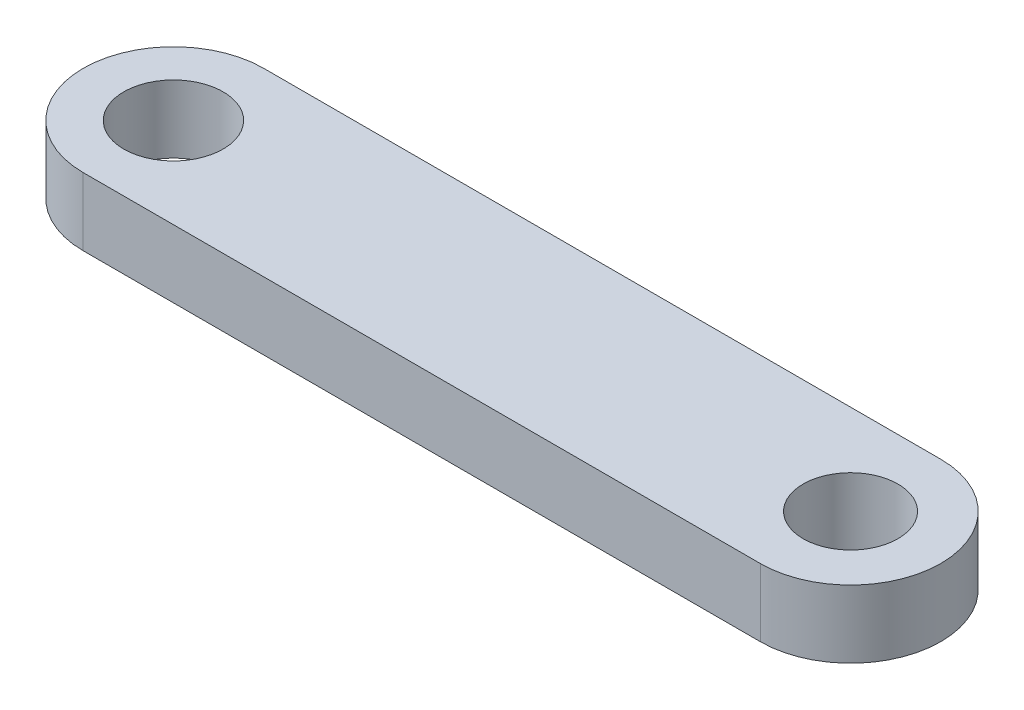
ISO-10303-21;
HEADER;
FILE_DESCRIPTION(('STEP AP214'),'2;1');
FILE_NAME('part.step','',(''),(''),'','','');
FILE_SCHEMA(('AUTOMOTIVE_DESIGN { 1 0 10303 214 1 1 1 1 }'));
ENDSEC;
DATA;
#1=APPLICATION_CONTEXT('core data for automotive mechanical design processes');
#2=APPLICATION_PROTOCOL_DEFINITION('international standard','automotive_design',2000,#1);
#3=PRODUCT_CONTEXT('',#1,'mechanical');
#4=PRODUCT('Part','Part','',(#3));
#5=PRODUCT_RELATED_PRODUCT_CATEGORY('part','',(#4));
#6=PRODUCT_DEFINITION_FORMATION('','',#4);
#7=PRODUCT_DEFINITION_CONTEXT('part definition',#1,'design');
#8=PRODUCT_DEFINITION('design','',#6,#7);
#9=PRODUCT_DEFINITION_SHAPE('','',#8);
#10=(LENGTH_UNIT() NAMED_UNIT(*) SI_UNIT(.MILLI.,.METRE.));
#11=(NAMED_UNIT(*) PLANE_ANGLE_UNIT() SI_UNIT($,.RADIAN.));
#12=(NAMED_UNIT(*) SI_UNIT($,.STERADIAN.) SOLID_ANGLE_UNIT());
#13=UNCERTAINTY_MEASURE_WITH_UNIT(LENGTH_MEASURE(1.E-05),#10,'distance_accuracy_value','');
#14=(GEOMETRIC_REPRESENTATION_CONTEXT(3) GLOBAL_UNCERTAINTY_ASSIGNED_CONTEXT((#13)) GLOBAL_UNIT_ASSIGNED_CONTEXT((#10,
#11,#12)) REPRESENTATION_CONTEXT('',''));
#15=CARTESIAN_POINT('',(0.,0.,0.));
#16=DIRECTION('',(0.,0.,1.));
#17=DIRECTION('',(1.,0.,0.));
#18=AXIS2_PLACEMENT_3D('',#15,#16,#17);
#19=CARTESIAN_POINT('',(-15.,3.,0.));
#20=DIRECTION('',(0.,1.,0.));
#21=DIRECTION('',(0.,0.,1.));
#22=AXIS2_PLACEMENT_3D('',#19,#20,#21);
#23=PLANE('',#22);
#24=CARTESIAN_POINT('',(15.,3.,0.));
#25=DIRECTION('',(0.,1.,0.));
#26=DIRECTION('',(0.,0.,1.));
#27=AXIS2_PLACEMENT_3D('',#24,#25,#26);
#28=CIRCLE('',#27,2.1);
#29=CARTESIAN_POINT('',(15.,3.,2.1));
#30=VERTEX_POINT('',#29);
#31=EDGE_CURVE('E99',#30,#30,#28,.T.);
#32=ORIENTED_EDGE('',*,*,#31,.F.);
#33=EDGE_LOOP('',(#32));
#34=FACE_BOUND('',#33,.T.);
#35=CARTESIAN_POINT('',(-15.,3.,0.));
#36=DIRECTION('',(0.,1.,0.));
#37=DIRECTION('',(0.,0.,1.));
#38=AXIS2_PLACEMENT_3D('',#35,#36,#37);
#39=CIRCLE('',#38,4.);
#40=CARTESIAN_POINT('',(-15.,3.,-4.));
#41=VERTEX_POINT('',#40);
#42=CARTESIAN_POINT('',(-15.,3.,4.));
#43=VERTEX_POINT('',#42);
#44=EDGE_CURVE('E84',#41,#43,#39,.T.);
#45=ORIENTED_EDGE('',*,*,#44,.T.);
#46=DIRECTION('',(1.,0.,0.));
#47=VECTOR('',#46,1.);
#48=CARTESIAN_POINT('',(-15.,3.,4.));
#49=LINE('',#48,#47);
#50=CARTESIAN_POINT('',(15.,3.,3.99999999999999));
#51=VERTEX_POINT('',#50);
#52=EDGE_CURVE('E79',#43,#51,#49,.T.);
#53=ORIENTED_EDGE('',*,*,#52,.T.);
#54=CARTESIAN_POINT('',(15.,3.,0.));
#55=DIRECTION('',(0.,1.,0.));
#56=DIRECTION('',(0.,0.,1.));
#57=AXIS2_PLACEMENT_3D('',#54,#55,#56);
#58=CIRCLE('',#57,4.);
#59=CARTESIAN_POINT('',(15.,3.,-4.00000000000001));
#60=VERTEX_POINT('',#59);
#61=EDGE_CURVE('E82',#51,#60,#58,.T.);
#62=ORIENTED_EDGE('',*,*,#61,.T.);
#63=DIRECTION('',(-1.,0.,0.));
#64=VECTOR('',#63,1.);
#65=CARTESIAN_POINT('',(-15.,3.,-4.));
#66=LINE('',#65,#64);
#67=EDGE_CURVE('E49',#60,#41,#66,.T.);
#68=ORIENTED_EDGE('',*,*,#67,.T.);
#69=EDGE_LOOP('',(#45,#53,#62,#68));
#70=FACE_BOUND('',#69,.T.);
#71=CARTESIAN_POINT('',(-15.,3.,0.));
#72=DIRECTION('',(0.,1.,0.));
#73=DIRECTION('',(0.,0.,1.));
#74=AXIS2_PLACEMENT_3D('',#71,#72,#73);
#75=CIRCLE('',#74,2.2);
#76=CARTESIAN_POINT('',(-15.,3.,2.2));
#77=VERTEX_POINT('',#76);
#78=EDGE_CURVE('E114',#77,#77,#75,.T.);
#79=ORIENTED_EDGE('',*,*,#78,.F.);
#80=EDGE_LOOP('',(#79));
#81=FACE_BOUND('',#80,.T.);
#82=ADVANCED_FACE('F32',(#34,#70,#81),#23,.T.);
#83=CARTESIAN_POINT('',(-15.,0.,0.));
#84=DIRECTION('',(0.,1.,0.));
#85=DIRECTION('',(0.,0.,1.));
#86=AXIS2_PLACEMENT_3D('',#83,#84,#85);
#87=PLANE('',#86);
#88=CARTESIAN_POINT('',(-15.,0.,0.));
#89=DIRECTION('',(0.,1.,0.));
#90=DIRECTION('',(0.,0.,1.));
#91=AXIS2_PLACEMENT_3D('',#88,#89,#90);
#92=CIRCLE('',#91,4.);
#93=CARTESIAN_POINT('',(-15.,0.,-4.));
#94=VERTEX_POINT('',#93);
#95=CARTESIAN_POINT('',(-15.,0.,4.));
#96=VERTEX_POINT('',#95);
#97=EDGE_CURVE('E96',#94,#96,#92,.T.);
#98=ORIENTED_EDGE('',*,*,#97,.F.);
#99=DIRECTION('',(-1.,0.,0.));
#100=VECTOR('',#99,1.);
#101=CARTESIAN_POINT('',(-15.,0.,-4.));
#102=LINE('',#101,#100);
#103=CARTESIAN_POINT('',(15.,0.,-4.00000000000001));
#104=VERTEX_POINT('',#103);
#105=EDGE_CURVE('E72',#104,#94,#102,.T.);
#106=ORIENTED_EDGE('',*,*,#105,.F.);
#107=CARTESIAN_POINT('',(15.,0.,0.));
#108=DIRECTION('',(0.,1.,0.));
#109=DIRECTION('',(0.,0.,1.));
#110=AXIS2_PLACEMENT_3D('',#107,#108,#109);
#111=CIRCLE('',#110,4.);
#112=CARTESIAN_POINT('',(15.,0.,3.99999999999999));
#113=VERTEX_POINT('',#112);
#114=EDGE_CURVE('E66',#113,#104,#111,.T.);
#115=ORIENTED_EDGE('',*,*,#114,.F.);
#116=DIRECTION('',(1.,0.,0.));
#117=VECTOR('',#116,1.);
#118=CARTESIAN_POINT('',(-15.,0.,4.));
#119=LINE('',#118,#117);
#120=EDGE_CURVE('E88',#96,#113,#119,.T.);
#121=ORIENTED_EDGE('',*,*,#120,.F.);
#122=EDGE_LOOP('',(#98,#106,#115,#121));
#123=FACE_BOUND('',#122,.T.);
#124=CARTESIAN_POINT('',(15.,0.,0.));
#125=DIRECTION('',(0.,1.,0.));
#126=DIRECTION('',(0.,0.,1.));
#127=AXIS2_PLACEMENT_3D('',#124,#125,#126);
#128=CIRCLE('',#127,2.1);
#129=CARTESIAN_POINT('',(15.,0.,2.1));
#130=VERTEX_POINT('',#129);
#131=EDGE_CURVE('E111',#130,#130,#128,.T.);
#132=ORIENTED_EDGE('',*,*,#131,.T.);
#133=EDGE_LOOP('',(#132));
#134=FACE_BOUND('',#133,.T.);
#135=CARTESIAN_POINT('',(-15.,0.,0.));
#136=DIRECTION('',(0.,1.,0.));
#137=DIRECTION('',(0.,0.,1.));
#138=AXIS2_PLACEMENT_3D('',#135,#136,#137);
#139=CIRCLE('',#138,2.2);
#140=CARTESIAN_POINT('',(-15.,0.,2.2));
#141=VERTEX_POINT('',#140);
#142=EDGE_CURVE('E117',#141,#141,#139,.T.);
#143=ORIENTED_EDGE('',*,*,#142,.T.);
#144=EDGE_LOOP('',(#143));
#145=FACE_BOUND('',#144,.T.);
#146=ADVANCED_FACE('F107',(#123,#134,#145),#87,.F.);
#147=CARTESIAN_POINT('',(-15.,3.,0.));
#148=DIRECTION('',(0.,-1.,0.));
#149=DIRECTION('',(0.,0.,-1.));
#150=AXIS2_PLACEMENT_3D('',#147,#148,#149);
#151=CYLINDRICAL_SURFACE('',#150,4.);
#152=ORIENTED_EDGE('',*,*,#97,.T.);
#153=DIRECTION('',(0.,-1.,0.));
#154=VECTOR('',#153,1.);
#155=CARTESIAN_POINT('',(-15.,3.,4.));
#156=LINE('',#155,#154);
#157=EDGE_CURVE('E11',#43,#96,#156,.T.);
#158=ORIENTED_EDGE('',*,*,#157,.F.);
#159=ORIENTED_EDGE('',*,*,#44,.F.);
#160=DIRECTION('',(0.,-1.,0.));
#161=VECTOR('',#160,1.);
#162=CARTESIAN_POINT('',(-15.,3.,-4.));
#163=LINE('',#162,#161);
#164=EDGE_CURVE('E92',#41,#94,#163,.T.);
#165=ORIENTED_EDGE('',*,*,#164,.T.);
#166=EDGE_LOOP('',(#152,#158,#159,#165));
#167=FACE_BOUND('',#166,.T.);
#168=ADVANCED_FACE('F34',(#167),#151,.T.);
#169=CARTESIAN_POINT('',(-15.,3.,4.));
#170=DIRECTION('',(0.,0.,-1.));
#171=DIRECTION('',(-1.,0.,0.));
#172=AXIS2_PLACEMENT_3D('',#169,#170,#171);
#173=PLANE('',#172);
#174=ORIENTED_EDGE('',*,*,#120,.T.);
#175=DIRECTION('',(0.,-1.,0.));
#176=VECTOR('',#175,1.);
#177=CARTESIAN_POINT('',(15.,3.,3.99999999999999));
#178=LINE('',#177,#176);
#179=EDGE_CURVE('E41',#51,#113,#178,.T.);
#180=ORIENTED_EDGE('',*,*,#179,.F.);
#181=ORIENTED_EDGE('',*,*,#52,.F.);
#182=ORIENTED_EDGE('',*,*,#157,.T.);
#183=EDGE_LOOP('',(#174,#180,#181,#182));
#184=FACE_BOUND('',#183,.T.);
#185=ADVANCED_FACE('F87',(#184),#173,.F.);
#186=CARTESIAN_POINT('',(15.,3.,0.));
#187=DIRECTION('',(0.,-1.,0.));
#188=DIRECTION('',(0.,0.,-1.));
#189=AXIS2_PLACEMENT_3D('',#186,#187,#188);
#190=CYLINDRICAL_SURFACE('',#189,4.);
#191=ORIENTED_EDGE('',*,*,#114,.T.);
#192=DIRECTION('',(0.,-1.,0.));
#193=VECTOR('',#192,1.);
#194=CARTESIAN_POINT('',(15.,3.,-4.00000000000001));
#195=LINE('',#194,#193);
#196=EDGE_CURVE('E89',#60,#104,#195,.T.);
#197=ORIENTED_EDGE('',*,*,#196,.F.);
#198=ORIENTED_EDGE('',*,*,#61,.F.);
#199=ORIENTED_EDGE('',*,*,#179,.T.);
#200=EDGE_LOOP('',(#191,#197,#198,#199));
#201=FACE_BOUND('',#200,.T.);
#202=ADVANCED_FACE('F90',(#201),#190,.T.);
#203=CARTESIAN_POINT('',(-15.,3.,-4.));
#204=DIRECTION('',(0.,0.,1.));
#205=DIRECTION('',(1.,0.,0.));
#206=AXIS2_PLACEMENT_3D('',#203,#204,#205);
#207=PLANE('',#206);
#208=ORIENTED_EDGE('',*,*,#105,.T.);
#209=ORIENTED_EDGE('',*,*,#164,.F.);
#210=ORIENTED_EDGE('',*,*,#67,.F.);
#211=ORIENTED_EDGE('',*,*,#196,.T.);
#212=EDGE_LOOP('',(#208,#209,#210,#211));
#213=FACE_BOUND('',#212,.T.);
#214=ADVANCED_FACE('F104',(#213),#207,.F.);
#215=CARTESIAN_POINT('',(15.,3.,0.));
#216=DIRECTION('',(0.,-1.,0.));
#217=DIRECTION('',(0.,0.,-1.));
#218=AXIS2_PLACEMENT_3D('',#215,#216,#217);
#219=CYLINDRICAL_SURFACE('',#218,2.1);
#220=ORIENTED_EDGE('',*,*,#31,.T.);
#221=EDGE_LOOP('',(#220));
#222=FACE_BOUND('',#221,.T.);
#223=ORIENTED_EDGE('',*,*,#131,.F.);
#224=EDGE_LOOP('',(#223));
#225=FACE_BOUND('',#224,.T.);
#226=ADVANCED_FACE('F134',(#222,#225),#219,.F.);
#227=CARTESIAN_POINT('',(-15.,3.,0.));
#228=DIRECTION('',(0.,-1.,0.));
#229=DIRECTION('',(0.,0.,-1.));
#230=AXIS2_PLACEMENT_3D('',#227,#228,#229);
#231=CYLINDRICAL_SURFACE('',#230,2.2);
#232=ORIENTED_EDGE('',*,*,#78,.T.);
#233=EDGE_LOOP('',(#232));
#234=FACE_BOUND('',#233,.T.);
#235=ORIENTED_EDGE('',*,*,#142,.F.);
#236=EDGE_LOOP('',(#235));
#237=FACE_BOUND('',#236,.T.);
#238=ADVANCED_FACE('F123',(#234,#237),#231,.F.);
#239=CLOSED_SHELL('',(#82,#146,#168,#185,#202,#214,#226,#238));
#240=MANIFOLD_SOLID_BREP('B2',#239);
#241=ADVANCED_BREP_SHAPE_REPRESENTATION('',(#18,#240),#14);
#242=SHAPE_DEFINITION_REPRESENTATION(#9,#241);
ENDSEC;
END-ISO-10303-21;
